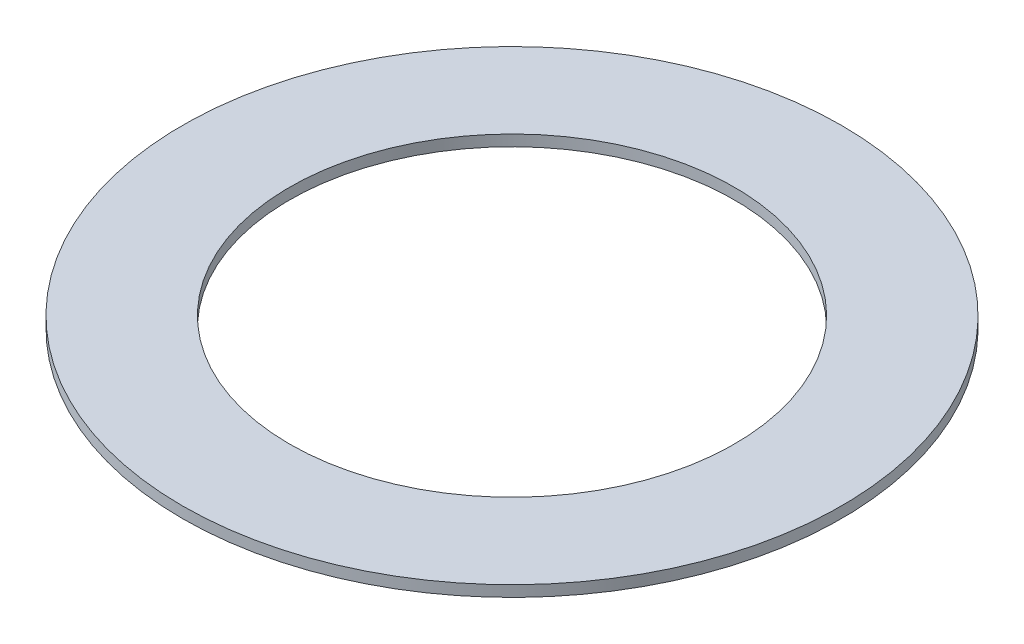
ISO-10303-21;
HEADER;
FILE_DESCRIPTION(('STEP AP214'),'2;1');
FILE_NAME('part.step','',(''),(''),'','','');
FILE_SCHEMA(('AUTOMOTIVE_DESIGN { 1 0 10303 214 1 1 1 1 }'));
ENDSEC;
DATA;
#1=APPLICATION_CONTEXT('core data for automotive mechanical design processes');
#2=APPLICATION_PROTOCOL_DEFINITION('international standard','automotive_design',2000,#1);
#3=PRODUCT_CONTEXT('',#1,'mechanical');
#4=PRODUCT('Part','Part','',(#3));
#5=PRODUCT_RELATED_PRODUCT_CATEGORY('part','',(#4));
#6=PRODUCT_DEFINITION_FORMATION('','',#4);
#7=PRODUCT_DEFINITION_CONTEXT('part definition',#1,'design');
#8=PRODUCT_DEFINITION('design','',#6,#7);
#9=PRODUCT_DEFINITION_SHAPE('','',#8);
#10=(LENGTH_UNIT() NAMED_UNIT(*) SI_UNIT(.MILLI.,.METRE.));
#11=(NAMED_UNIT(*) PLANE_ANGLE_UNIT() SI_UNIT($,.RADIAN.));
#12=(NAMED_UNIT(*) SI_UNIT($,.STERADIAN.) SOLID_ANGLE_UNIT());
#13=UNCERTAINTY_MEASURE_WITH_UNIT(LENGTH_MEASURE(1.E-05),#10,'distance_accuracy_value','');
#14=(GEOMETRIC_REPRESENTATION_CONTEXT(3) GLOBAL_UNCERTAINTY_ASSIGNED_CONTEXT((#13)) GLOBAL_UNIT_ASSIGNED_CONTEXT((#10,
#11,#12)) REPRESENTATION_CONTEXT('',''));
#15=CARTESIAN_POINT('',(0.,0.,0.));
#16=DIRECTION('',(0.,0.,1.));
#17=DIRECTION('',(1.,0.,0.));
#18=AXIS2_PLACEMENT_3D('',#15,#16,#17);
#19=CARTESIAN_POINT('',(0.,1.,0.));
#20=DIRECTION('',(0.,1.,0.));
#21=DIRECTION('',(0.,0.,1.));
#22=AXIS2_PLACEMENT_3D('',#19,#20,#21);
#23=PLANE('',#22);
#24=CARTESIAN_POINT('',(0.,1.,0.));
#25=DIRECTION('',(0.,1.,0.));
#26=DIRECTION('',(0.,0.,1.));
#27=AXIS2_PLACEMENT_3D('',#24,#25,#26);
#28=CIRCLE('',#27,29.85);
#29=CARTESIAN_POINT('',(0.,1.,29.85));
#30=VERTEX_POINT('',#29);
#31=EDGE_CURVE('E10',#30,#30,#28,.T.);
#32=ORIENTED_EDGE('',*,*,#31,.T.);
#33=EDGE_LOOP('',(#32));
#34=FACE_BOUND('',#33,.T.);
#35=CARTESIAN_POINT('',(0.,1.,0.));
#36=DIRECTION('',(0.,1.,0.));
#37=DIRECTION('',(0.,0.,1.));
#38=AXIS2_PLACEMENT_3D('',#35,#36,#37);
#39=CIRCLE('',#38,20.15);
#40=CARTESIAN_POINT('',(0.,1.,20.15));
#41=VERTEX_POINT('',#40);
#42=EDGE_CURVE('E41',#41,#41,#39,.T.);
#43=ORIENTED_EDGE('',*,*,#42,.F.);
#44=EDGE_LOOP('',(#43));
#45=FACE_BOUND('',#44,.T.);
#46=ADVANCED_FACE('F30',(#34,#45),#23,.T.);
#47=CARTESIAN_POINT('',(0.,0.,0.));
#48=DIRECTION('',(0.,1.,0.));
#49=DIRECTION('',(0.,0.,1.));
#50=AXIS2_PLACEMENT_3D('',#47,#48,#49);
#51=PLANE('',#50);
#52=CARTESIAN_POINT('',(0.,0.,0.));
#53=DIRECTION('',(0.,1.,0.));
#54=DIRECTION('',(0.,0.,1.));
#55=AXIS2_PLACEMENT_3D('',#52,#53,#54);
#56=CIRCLE('',#55,29.85);
#57=CARTESIAN_POINT('',(0.,0.,29.85));
#58=VERTEX_POINT('',#57);
#59=EDGE_CURVE('E34',#58,#58,#56,.T.);
#60=ORIENTED_EDGE('',*,*,#59,.F.);
#61=EDGE_LOOP('',(#60));
#62=FACE_BOUND('',#61,.T.);
#63=CARTESIAN_POINT('',(0.,0.,0.));
#64=DIRECTION('',(0.,1.,0.));
#65=DIRECTION('',(0.,0.,1.));
#66=AXIS2_PLACEMENT_3D('',#63,#64,#65);
#67=CIRCLE('',#66,20.15);
#68=CARTESIAN_POINT('',(0.,0.,20.15));
#69=VERTEX_POINT('',#68);
#70=EDGE_CURVE('E43',#69,#69,#67,.T.);
#71=ORIENTED_EDGE('',*,*,#70,.T.);
#72=EDGE_LOOP('',(#71));
#73=FACE_BOUND('',#72,.T.);
#74=ADVANCED_FACE('F53',(#62,#73),#51,.F.);
#75=CARTESIAN_POINT('',(0.,1.,0.));
#76=DIRECTION('',(0.,-1.,0.));
#77=DIRECTION('',(0.,0.,-1.));
#78=AXIS2_PLACEMENT_3D('',#75,#76,#77);
#79=CYLINDRICAL_SURFACE('',#78,29.85);
#80=ORIENTED_EDGE('',*,*,#31,.F.);
#81=EDGE_LOOP('',(#80));
#82=FACE_BOUND('',#81,.T.);
#83=ORIENTED_EDGE('',*,*,#59,.T.);
#84=EDGE_LOOP('',(#83));
#85=FACE_BOUND('',#84,.T.);
#86=ADVANCED_FACE('F32',(#82,#85),#79,.T.);
#87=CARTESIAN_POINT('',(0.,1.,0.));
#88=DIRECTION('',(0.,-1.,0.));
#89=DIRECTION('',(0.,0.,-1.));
#90=AXIS2_PLACEMENT_3D('',#87,#88,#89);
#91=CYLINDRICAL_SURFACE('',#90,20.15);
#92=ORIENTED_EDGE('',*,*,#42,.T.);
#93=EDGE_LOOP('',(#92));
#94=FACE_BOUND('',#93,.T.);
#95=ORIENTED_EDGE('',*,*,#70,.F.);
#96=EDGE_LOOP('',(#95));
#97=FACE_BOUND('',#96,.T.);
#98=ADVANCED_FACE('F49',(#94,#97),#91,.F.);
#99=CLOSED_SHELL('',(#46,#74,#86,#98));
#100=MANIFOLD_SOLID_BREP('B2',#99);
#101=ADVANCED_BREP_SHAPE_REPRESENTATION('',(#18,#100),#14);
#102=SHAPE_DEFINITION_REPRESENTATION(#9,#101);
ENDSEC;
END-ISO-10303-21;
